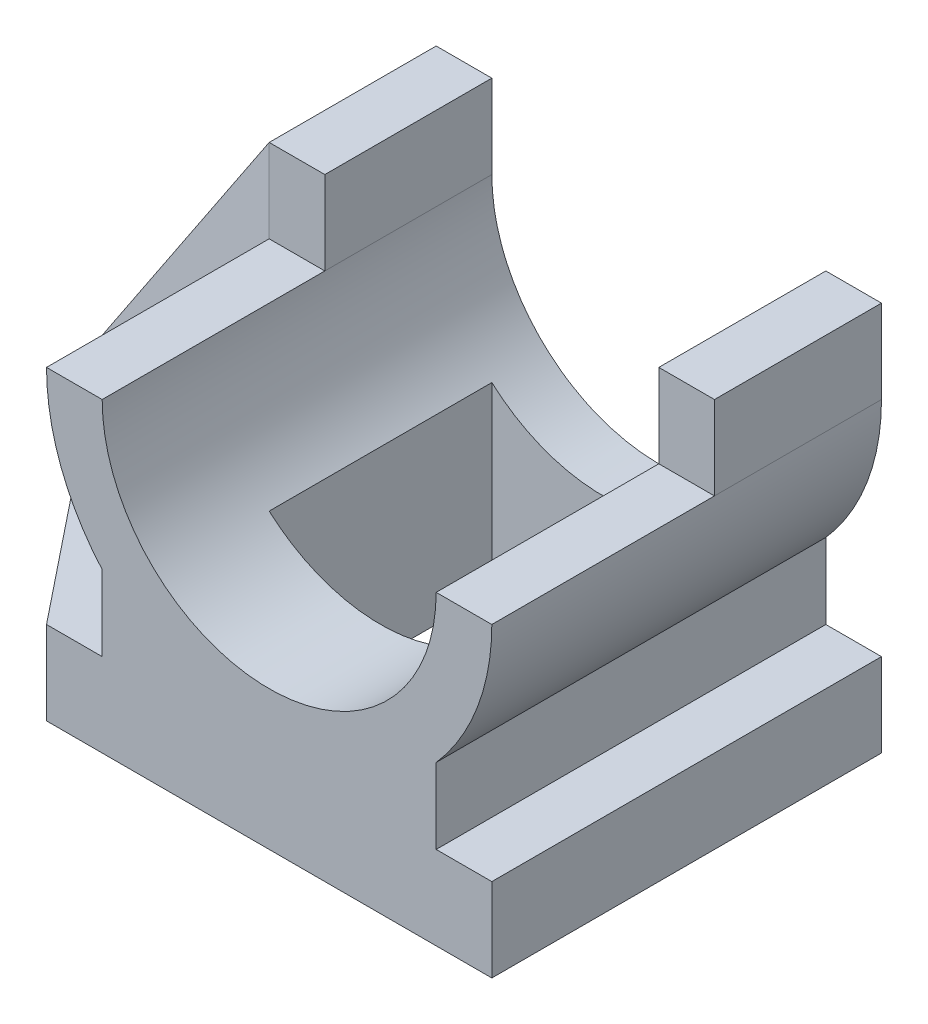
ISO-10303-21;
HEADER;
FILE_DESCRIPTION(('STEP AP214'),'2;1');
FILE_NAME('part.step','',(''),(''),'','','');
FILE_SCHEMA(('AUTOMOTIVE_DESIGN { 1 0 10303 214 1 1 1 1 }'));
ENDSEC;
DATA;
#1=APPLICATION_CONTEXT('core data for automotive mechanical design processes');
#2=APPLICATION_PROTOCOL_DEFINITION('international standard','automotive_design',2000,#1);
#3=PRODUCT_CONTEXT('',#1,'mechanical');
#4=PRODUCT('Part','Part','',(#3));
#5=PRODUCT_RELATED_PRODUCT_CATEGORY('part','',(#4));
#6=PRODUCT_DEFINITION_FORMATION('','',#4);
#7=PRODUCT_DEFINITION_CONTEXT('part definition',#1,'design');
#8=PRODUCT_DEFINITION('design','',#6,#7);
#9=PRODUCT_DEFINITION_SHAPE('','',#8);
#10=(LENGTH_UNIT() NAMED_UNIT(*) SI_UNIT(.MILLI.,.METRE.));
#11=(NAMED_UNIT(*) PLANE_ANGLE_UNIT() SI_UNIT($,.RADIAN.));
#12=(NAMED_UNIT(*) SI_UNIT($,.STERADIAN.) SOLID_ANGLE_UNIT());
#13=UNCERTAINTY_MEASURE_WITH_UNIT(LENGTH_MEASURE(1.E-05),#10,'distance_accuracy_value','');
#14=(GEOMETRIC_REPRESENTATION_CONTEXT(3) GLOBAL_UNCERTAINTY_ASSIGNED_CONTEXT((#13)) GLOBAL_UNIT_ASSIGNED_CONTEXT((#10,
#11,#12)) REPRESENTATION_CONTEXT('',''));
#15=CARTESIAN_POINT('',(0.,0.,0.));
#16=DIRECTION('',(0.,0.,1.));
#17=DIRECTION('',(1.,0.,0.));
#18=AXIS2_PLACEMENT_3D('',#15,#16,#17);
#19=CARTESIAN_POINT('',(0.,0.,30.));
#20=DIRECTION('',(0.,0.,1.));
#21=DIRECTION('',(-1.,0.,0.));
#22=AXIS2_PLACEMENT_3D('',#19,#20,#21);
#23=PLANE('',#22);
#24=DIRECTION('',(1.,0.,0.));
#25=VECTOR('',#24,1.);
#26=CARTESIAN_POINT('',(-40.,70.,30.));
#27=LINE('',#26,#25);
#28=CARTESIAN_POINT('',(-40.,70.,30.));
#29=VERTEX_POINT('',#28);
#30=CARTESIAN_POINT('',(-30.,70.,30.));
#31=VERTEX_POINT('',#30);
#32=EDGE_CURVE('E562',#29,#31,#27,.T.);
#33=ORIENTED_EDGE('',*,*,#32,.F.);
#34=DIRECTION('',(0.,-1.,0.));
#35=VECTOR('',#34,1.);
#36=CARTESIAN_POINT('',(-40.,75.,30.));
#37=LINE('',#36,#35);
#38=CARTESIAN_POINT('',(-40.,55.,30.));
#39=VERTEX_POINT('',#38);
#40=EDGE_CURVE('E204',#29,#39,#37,.T.);
#41=ORIENTED_EDGE('',*,*,#40,.T.);
#42=DIRECTION('',(-1.,0.,0.));
#43=VECTOR('',#42,1.);
#44=CARTESIAN_POINT('',(-30.,55.,30.));
#45=LINE('',#44,#43);
#46=CARTESIAN_POINT('',(-30.,55.,30.));
#47=VERTEX_POINT('',#46);
#48=EDGE_CURVE('E506',#47,#39,#45,.T.);
#49=ORIENTED_EDGE('',*,*,#48,.F.);
#50=DIRECTION('',(0.,-1.,0.));
#51=VECTOR('',#50,1.);
#52=CARTESIAN_POINT('',(-30.,70.,30.));
#53=LINE('',#52,#51);
#54=EDGE_CURVE('E270',#31,#47,#53,.T.);
#55=ORIENTED_EDGE('',*,*,#54,.F.);
#56=EDGE_LOOP('',(#33,#41,#49,#55));
#57=FACE_BOUND('',#56,.T.);
#58=ADVANCED_FACE('F39',(#57),#23,.T.);
#59=CARTESIAN_POINT('',(0.,55.,30.));
#60=DIRECTION('',(0.,0.,1.));
#61=DIRECTION('',(1.,0.,0.));
#62=AXIS2_PLACEMENT_3D('',#59,#60,#61);
#63=CIRCLE('',#62,40.);
#64=CARTESIAN_POINT('',(-30.,28.5424868893541,30.));
#65=VERTEX_POINT('',#64);
#66=EDGE_CURVE('E62',#65,#39,#63,.F.);
#67=ORIENTED_EDGE('',*,*,#66,.T.);
#68=CARTESIAN_POINT('',(-40.,15.,30.));
#69=VERTEX_POINT('',#68);
#70=EDGE_CURVE('E197',#39,#69,#37,.T.);
#71=ORIENTED_EDGE('',*,*,#70,.T.);
#72=DIRECTION('',(1.,0.,0.));
#73=VECTOR('',#72,1.);
#74=CARTESIAN_POINT('',(-30.,15.,30.));
#75=LINE('',#74,#73);
#76=CARTESIAN_POINT('',(-30.,15.,30.));
#77=VERTEX_POINT('',#76);
#78=EDGE_CURVE('E53',#69,#77,#75,.T.);
#79=ORIENTED_EDGE('',*,*,#78,.T.);
#80=DIRECTION('',(0.,1.,0.));
#81=VECTOR('',#80,1.);
#82=CARTESIAN_POINT('',(-30.,55.,30.));
#83=LINE('',#82,#81);
#84=EDGE_CURVE('E209',#77,#65,#83,.T.);
#85=ORIENTED_EDGE('',*,*,#84,.T.);
#86=EDGE_LOOP('',(#67,#71,#79,#85));
#87=FACE_BOUND('',#86,.T.);
#88=ADVANCED_FACE('F201',(#87),#23,.T.);
#89=CARTESIAN_POINT('',(-80.,15.,30.));
#90=DIRECTION('',(0.808736084303189,-0.588171697675046,0.));
#91=DIRECTION('',(0.588171697675046,0.808736084303189,0.));
#92=AXIS2_PLACEMENT_3D('',#89,#90,#91);
#93=PLANE('',#92);
#94=DIRECTION('',(-0.581914373962646,-0.800132264198639,-0.145478593490662));
#95=VECTOR('',#94,1.);
#96=CARTESIAN_POINT('',(-79.1534391534392,16.1640211640212,20.2116402116402));
#97=LINE('',#96,#95);
#98=CARTESIAN_POINT('',(-80.,15.,20.));
#99=VERTEX_POINT('',#98);
#100=EDGE_CURVE('E11',#29,#99,#97,.T.);
#101=ORIENTED_EDGE('',*,*,#100,.F.);
#102=DIRECTION('',(0.,0.,-1.));
#103=VECTOR('',#102,1.);
#104=CARTESIAN_POINT('',(-40.,70.,30.));
#105=LINE('',#104,#103);
#106=CARTESIAN_POINT('',(-40.,70.,0.));
#107=VERTEX_POINT('',#106);
#108=EDGE_CURVE('E501',#29,#107,#105,.T.);
#109=ORIENTED_EDGE('',*,*,#108,.T.);
#110=DIRECTION('',(-0.588171697675046,-0.808736084303189,0.));
#111=VECTOR('',#110,1.);
#112=CARTESIAN_POINT('',(-80.,15.,0.));
#113=LINE('',#112,#111);
#114=CARTESIAN_POINT('',(-80.,15.,0.));
#115=VERTEX_POINT('',#114);
#116=EDGE_CURVE('E211',#107,#115,#113,.T.);
#117=ORIENTED_EDGE('',*,*,#116,.T.);
#118=DIRECTION('',(0.,0.,1.));
#119=VECTOR('',#118,1.);
#120=CARTESIAN_POINT('',(-80.,15.,0.));
#121=LINE('',#120,#119);
#122=EDGE_CURVE('E218',#115,#99,#121,.T.);
#123=ORIENTED_EDGE('',*,*,#122,.T.);
#124=EDGE_LOOP('',(#101,#109,#117,#123));
#125=FACE_BOUND('',#124,.T.);
#126=ADVANCED_FACE('F303',(#125),#93,.F.);
#127=CARTESIAN_POINT('',(0.,15.,0.));
#128=DIRECTION('',(0.,-1.,0.));
#129=DIRECTION('',(0.,0.,-1.));
#130=AXIS2_PLACEMENT_3D('',#127,#128,#129);
#131=PLANE('',#130);
#132=ORIENTED_EDGE('',*,*,#78,.F.);
#133=DIRECTION('',(-0.970142500145332,0.,-0.242535625036333));
#134=VECTOR('',#133,1.);
#135=CARTESIAN_POINT('',(-80.,15.,20.));
#136=LINE('',#135,#134);
#137=EDGE_CURVE('E195',#69,#99,#136,.T.);
#138=ORIENTED_EDGE('',*,*,#137,.T.);
#139=DIRECTION('',(0.624695047554424,0.,0.78086880944303));
#140=VECTOR('',#139,1.);
#141=CARTESIAN_POINT('',(-80.,15.,20.));
#142=LINE('',#141,#140);
#143=CARTESIAN_POINT('',(-40.,15.,70.));
#144=VERTEX_POINT('',#143);
#145=EDGE_CURVE('E225',#99,#144,#142,.T.);
#146=ORIENTED_EDGE('',*,*,#145,.T.);
#147=DIRECTION('',(-1.,0.,0.));
#148=VECTOR('',#147,1.);
#149=CARTESIAN_POINT('',(-40.,15.,70.));
#150=LINE('',#149,#148);
#151=CARTESIAN_POINT('',(-30.,15.,70.));
#152=VERTEX_POINT('',#151);
#153=EDGE_CURVE('E439',#152,#144,#150,.T.);
#154=ORIENTED_EDGE('',*,*,#153,.F.);
#155=DIRECTION('',(0.,0.,-1.));
#156=VECTOR('',#155,1.);
#157=CARTESIAN_POINT('',(-30.,15.,70.));
#158=LINE('',#157,#156);
#159=EDGE_CURVE('E207',#152,#77,#158,.T.);
#160=ORIENTED_EDGE('',*,*,#159,.T.);
#161=EDGE_LOOP('',(#132,#138,#146,#154,#160));
#162=FACE_BOUND('',#161,.T.);
#163=ADVANCED_FACE('F210',(#162),#131,.F.);
#164=CARTESIAN_POINT('',(0.,0.,0.));
#165=DIRECTION('',(0.,-1.,0.));
#166=DIRECTION('',(0.,0.,-1.));
#167=AXIS2_PLACEMENT_3D('',#164,#165,#166);
#168=PLANE('',#167);
#169=DIRECTION('',(1.,0.,0.));
#170=VECTOR('',#169,1.);
#171=CARTESIAN_POINT('',(40.,0.,70.));
#172=LINE('',#171,#170);
#173=CARTESIAN_POINT('',(-40.,0.,70.));
#174=VERTEX_POINT('',#173);
#175=CARTESIAN_POINT('',(40.,0.,70.));
#176=VERTEX_POINT('',#175);
#177=EDGE_CURVE('E427',#174,#176,#172,.T.);
#178=ORIENTED_EDGE('',*,*,#177,.F.);
#179=DIRECTION('',(0.624695047554424,0.,0.78086880944303));
#180=VECTOR('',#179,1.);
#181=CARTESIAN_POINT('',(-80.,0.,20.));
#182=LINE('',#181,#180);
#183=CARTESIAN_POINT('',(-80.,0.,20.));
#184=VERTEX_POINT('',#183);
#185=EDGE_CURVE('E224',#184,#174,#182,.T.);
#186=ORIENTED_EDGE('',*,*,#185,.F.);
#187=DIRECTION('',(0.,0.,1.));
#188=VECTOR('',#187,1.);
#189=CARTESIAN_POINT('',(-80.,0.,0.));
#190=LINE('',#189,#188);
#191=CARTESIAN_POINT('',(-80.,0.,0.));
#192=VERTEX_POINT('',#191);
#193=EDGE_CURVE('E217',#192,#184,#190,.T.);
#194=ORIENTED_EDGE('',*,*,#193,.F.);
#195=DIRECTION('',(-1.,0.,0.));
#196=VECTOR('',#195,1.);
#197=CARTESIAN_POINT('',(0.,0.,0.));
#198=LINE('',#197,#196);
#199=CARTESIAN_POINT('',(40.,0.,0.));
#200=VERTEX_POINT('',#199);
#201=EDGE_CURVE('E488',#200,#192,#198,.T.);
#202=ORIENTED_EDGE('',*,*,#201,.F.);
#203=DIRECTION('',(0.,0.,-1.));
#204=VECTOR('',#203,1.);
#205=CARTESIAN_POINT('',(40.,0.,0.));
#206=LINE('',#205,#204);
#207=EDGE_CURVE('E431',#176,#200,#206,.T.);
#208=ORIENTED_EDGE('',*,*,#207,.F.);
#209=EDGE_LOOP('',(#178,#186,#194,#202,#208));
#210=FACE_BOUND('',#209,.T.);
#211=DIRECTION('',(1.,0.,0.));
#212=VECTOR('',#211,1.);
#213=CARTESIAN_POINT('',(0.,0.,10.));
#214=LINE('',#213,#212);
#215=CARTESIAN_POINT('',(20.,0.,10.));
#216=VERTEX_POINT('',#215);
#217=CARTESIAN_POINT('',(-20.,0.,10.));
#218=VERTEX_POINT('',#217);
#219=EDGE_CURVE('E244',#216,#218,#214,.F.);
#220=ORIENTED_EDGE('',*,*,#219,.T.);
#221=DIRECTION('',(0.,0.,-1.));
#222=VECTOR('',#221,1.);
#223=CARTESIAN_POINT('',(-20.,0.,0.));
#224=LINE('',#223,#222);
#225=CARTESIAN_POINT('',(-20.,0.,50.));
#226=VERTEX_POINT('',#225);
#227=EDGE_CURVE('E233',#218,#226,#224,.F.);
#228=ORIENTED_EDGE('',*,*,#227,.T.);
#229=DIRECTION('',(1.,0.,0.));
#230=VECTOR('',#229,1.);
#231=CARTESIAN_POINT('',(0.,0.,50.));
#232=LINE('',#231,#230);
#233=CARTESIAN_POINT('',(20.,0.,50.));
#234=VERTEX_POINT('',#233);
#235=EDGE_CURVE('E378',#226,#234,#232,.T.);
#236=ORIENTED_EDGE('',*,*,#235,.T.);
#237=DIRECTION('',(0.,0.,-1.));
#238=VECTOR('',#237,1.);
#239=CARTESIAN_POINT('',(20.,0.,0.));
#240=LINE('',#239,#238);
#241=EDGE_CURVE('E381',#234,#216,#240,.T.);
#242=ORIENTED_EDGE('',*,*,#241,.T.);
#243=EDGE_LOOP('',(#220,#228,#236,#242));
#244=FACE_BOUND('',#243,.T.);
#245=ADVANCED_FACE('F304',(#210,#244),#168,.T.);
#246=CARTESIAN_POINT('',(40.,55.,70.));
#247=DIRECTION('',(0.,-1.,0.));
#248=DIRECTION('',(0.,0.,-1.));
#249=AXIS2_PLACEMENT_3D('',#246,#247,#248);
#250=PLANE('',#249);
#251=DIRECTION('',(0.,0.,-1.));
#252=VECTOR('',#251,1.);
#253=CARTESIAN_POINT('',(-30.,55.,70.));
#254=LINE('',#253,#252);
#255=CARTESIAN_POINT('',(-30.,55.,70.));
#256=VERTEX_POINT('',#255);
#257=EDGE_CURVE('E250',#256,#47,#254,.T.);
#258=ORIENTED_EDGE('',*,*,#257,.T.);
#259=ORIENTED_EDGE('',*,*,#48,.T.);
#260=DIRECTION('',(0.,0.,-1.));
#261=VECTOR('',#260,1.);
#262=CARTESIAN_POINT('',(-40.,55.,70.));
#263=LINE('',#262,#261);
#264=CARTESIAN_POINT('',(-40.,55.,70.));
#265=VERTEX_POINT('',#264);
#266=EDGE_CURVE('E445',#265,#39,#263,.T.);
#267=ORIENTED_EDGE('',*,*,#266,.F.);
#268=DIRECTION('',(-1.,0.,0.));
#269=VECTOR('',#268,1.);
#270=CARTESIAN_POINT('',(40.,55.,70.));
#271=LINE('',#270,#269);
#272=EDGE_CURVE('E468',#256,#265,#271,.T.);
#273=ORIENTED_EDGE('',*,*,#272,.F.);
#274=EDGE_LOOP('',(#258,#259,#267,#273));
#275=FACE_BOUND('',#274,.T.);
#276=ADVANCED_FACE('F321',(#275),#250,.F.);
#277=DIRECTION('',(0.,0.,-1.));
#278=VECTOR('',#277,1.);
#279=CARTESIAN_POINT('',(30.,55.,70.));
#280=LINE('',#279,#278);
#281=CARTESIAN_POINT('',(30.,55.,70.));
#282=VERTEX_POINT('',#281);
#283=CARTESIAN_POINT('',(30.,55.,30.));
#284=VERTEX_POINT('',#283);
#285=EDGE_CURVE('E248',#282,#284,#280,.T.);
#286=ORIENTED_EDGE('',*,*,#285,.F.);
#287=CARTESIAN_POINT('',(40.,55.,70.));
#288=VERTEX_POINT('',#287);
#289=EDGE_CURVE('E470',#288,#282,#271,.T.);
#290=ORIENTED_EDGE('',*,*,#289,.F.);
#291=DIRECTION('',(0.,0.,-1.));
#292=VECTOR('',#291,1.);
#293=CARTESIAN_POINT('',(40.,55.,70.));
#294=LINE('',#293,#292);
#295=CARTESIAN_POINT('',(40.,55.,30.));
#296=VERTEX_POINT('',#295);
#297=EDGE_CURVE('E471',#288,#296,#294,.T.);
#298=ORIENTED_EDGE('',*,*,#297,.T.);
#299=DIRECTION('',(1.,0.,0.));
#300=VECTOR('',#299,1.);
#301=CARTESIAN_POINT('',(30.,55.,30.));
#302=LINE('',#301,#300);
#303=EDGE_CURVE('E448',#284,#296,#302,.T.);
#304=ORIENTED_EDGE('',*,*,#303,.F.);
#305=EDGE_LOOP('',(#286,#290,#298,#304));
#306=FACE_BOUND('',#305,.T.);
#307=ADVANCED_FACE('F322',(#306),#250,.F.);
#308=CARTESIAN_POINT('',(0.,15.,0.));
#309=DIRECTION('',(0.,0.,1.));
#310=DIRECTION('',(1.,0.,0.));
#311=AXIS2_PLACEMENT_3D('',#308,#309,#310);
#312=PLANE('',#311);
#313=ORIENTED_EDGE('',*,*,#116,.F.);
#314=DIRECTION('',(1.,0.,0.));
#315=VECTOR('',#314,1.);
#316=CARTESIAN_POINT('',(-40.,70.,0.));
#317=LINE('',#316,#315);
#318=CARTESIAN_POINT('',(-30.,70.,0.));
#319=VERTEX_POINT('',#318);
#320=EDGE_CURVE('E358',#107,#319,#317,.T.);
#321=ORIENTED_EDGE('',*,*,#320,.T.);
#322=DIRECTION('',(0.,1.,0.));
#323=VECTOR('',#322,1.);
#324=CARTESIAN_POINT('',(-30.,15.,0.));
#325=LINE('',#324,#323);
#326=CARTESIAN_POINT('',(-30.,55.,-6.E-06));
#327=VERTEX_POINT('',#326);
#328=EDGE_CURVE('E351',#319,#327,#325,.F.);
#329=ORIENTED_EDGE('',*,*,#328,.T.);
#330=CARTESIAN_POINT('',(-30.,55.,0.));
#331=CARTESIAN_POINT('',(-30.,52.0455229689366,0.));
#332=CARTESIAN_POINT('',(-29.4235584120969,49.1472903395161,0.));
#333=CARTESIAN_POINT('',(-28.8472699521832,46.2498276068982,0.));
#334=CARTESIAN_POINT('',(-27.7163859753386,43.5194970290473,0.));
#335=CARTESIAN_POINT('',(-26.585903799089,40.7901365316584,0.));
#336=CARTESIAN_POINT('',(-24.9440883690764,38.3328930094119,0.));
#337=CARTESIAN_POINT('',(-23.3028562725141,35.876522540443,0.));
#338=CARTESIAN_POINT('',(-21.2132034355964,33.7867965644036,0.));
#339=CARTESIAN_POINT('',(-19.1242930477724,31.697813063444,0.));
#340=CARTESIAN_POINT('',(-16.6671069905881,30.0559116309236,0.));
#341=CARTESIAN_POINT('',(-14.2107939662426,28.4145935623959,0.));
#342=CARTESIAN_POINT('',(-11.4805029709527,27.2836140246614,0.));
#343=CARTESIAN_POINT('',(-8.75118204209679,26.1530363214892,0.));
#344=CARTESIAN_POINT('',(-5.85270966048385,25.5764415879031,0.));
#345=CARTESIAN_POINT('',(-2.95526709985799,25.0000517171824,0.));
#346=CARTESIAN_POINT('',(0.,25.,0.));
#347=CARTESIAN_POINT('',(2.95421709982425,24.9999483011926,0.));
#348=CARTESIAN_POINT('',(5.85270966048386,25.5764415879031,0.));
#349=CARTESIAN_POINT('',(8.75017239308338,26.1527300478112,0.));
#350=CARTESIAN_POINT('',(11.4805029709527,27.2836140246614,0.));
#351=CARTESIAN_POINT('',(14.2098634683337,28.4140962009057,0.));
#352=CARTESIAN_POINT('',(16.6671069905881,30.0559116309236,0.));
#353=CARTESIAN_POINT('',(19.1234774594981,31.6971437274466,0.));
#354=CARTESIAN_POINT('',(21.2132034355964,33.7867965644036,0.));
#355=CARTESIAN_POINT('',(23.3021869365168,35.8757069521689,0.));
#356=CARTESIAN_POINT('',(24.9440883690764,38.3328930094119,0.));
#357=CARTESIAN_POINT('',(26.5854064375838,40.7892060337271,0.));
#358=CARTESIAN_POINT('',(27.7163859753386,43.5194970290473,0.));
#359=CARTESIAN_POINT('',(28.846963678496,46.248817957849,0.));
#360=CARTESIAN_POINT('',(29.4235584120969,49.1472903395162,0.));
#361=CARTESIAN_POINT('',(30.,52.0449928761786,0.));
#362=CARTESIAN_POINT('',(30.,55.,0.));
#363=B_SPLINE_CURVE_WITH_KNOTS('',2,(#330,#331,#332,#333,#334,#335,#336,#337,#338,#339,#340,
#341,#342,#343,#344,#345,#346,#347,#348,#349,#350,#351,#352,#353,#354,#355,#356,#357,#358,#359,
#360,#361,#362),.UNSPECIFIED.,.F.,.F.,(3,2,2,2,2,2,2,2,2,2,2,2,2,2,2,2,3),(0.,0.0625,0.125,
0.1875,0.25,0.3125,0.375,0.4375,0.5,0.5625,0.625,0.6875,0.75,0.8125,0.875,0.9375,1.),.UNSPECIFIED.);
#364=CARTESIAN_POINT('',(30.,55.,-6.E-06));
#365=VERTEX_POINT('',#364);
#366=EDGE_CURVE('E251',#327,#365,#363,.T.);
#367=ORIENTED_EDGE('',*,*,#366,.T.);
#368=DIRECTION('',(0.,1.,0.));
#369=VECTOR('',#368,1.);
#370=CARTESIAN_POINT('',(30.,70.,0.));
#371=LINE('',#370,#369);
#372=CARTESIAN_POINT('',(30.,70.,0.));
#373=VERTEX_POINT('',#372);
#374=EDGE_CURVE('E362',#373,#365,#371,.F.);
#375=ORIENTED_EDGE('',*,*,#374,.F.);
#376=DIRECTION('',(-1.,0.,0.));
#377=VECTOR('',#376,1.);
#378=CARTESIAN_POINT('',(40.,70.,0.));
#379=LINE('',#378,#377);
#380=CARTESIAN_POINT('',(40.,70.,0.));
#381=VERTEX_POINT('',#380);
#382=EDGE_CURVE('E450',#381,#373,#379,.T.);
#383=ORIENTED_EDGE('',*,*,#382,.F.);
#384=DIRECTION('',(0.,1.,0.));
#385=VECTOR('',#384,1.);
#386=CARTESIAN_POINT('',(40.,55.,0.));
#387=LINE('',#386,#385);
#388=CARTESIAN_POINT('',(40.,55.,0.));
#389=VERTEX_POINT('',#388);
#390=EDGE_CURVE('E364',#389,#381,#387,.T.);
#391=ORIENTED_EDGE('',*,*,#390,.F.);
#392=CARTESIAN_POINT('',(0.,55.,0.));
#393=DIRECTION('',(0.,0.,1.));
#394=DIRECTION('',(1.,0.,0.));
#395=AXIS2_PLACEMENT_3D('',#392,#393,#394);
#396=CIRCLE('',#395,40.);
#397=CARTESIAN_POINT('',(30.,28.5424868893541,0.));
#398=VERTEX_POINT('',#397);
#399=EDGE_CURVE('E467',#398,#389,#396,.T.);
#400=ORIENTED_EDGE('',*,*,#399,.F.);
#401=DIRECTION('',(0.,1.,0.));
#402=VECTOR('',#401,1.);
#403=CARTESIAN_POINT('',(30.,15.,0.));
#404=LINE('',#403,#402);
#405=CARTESIAN_POINT('',(30.,15.,0.));
#406=VERTEX_POINT('',#405);
#407=EDGE_CURVE('E475',#406,#398,#404,.T.);
#408=ORIENTED_EDGE('',*,*,#407,.F.);
#409=DIRECTION('',(-1.,0.,0.));
#410=VECTOR('',#409,1.);
#411=CARTESIAN_POINT('',(0.,15.,0.));
#412=LINE('',#411,#410);
#413=CARTESIAN_POINT('',(40.,15.,0.));
#414=VERTEX_POINT('',#413);
#415=EDGE_CURVE('E489',#414,#406,#412,.T.);
#416=ORIENTED_EDGE('',*,*,#415,.F.);
#417=DIRECTION('',(0.,-1.,0.));
#418=VECTOR('',#417,1.);
#419=CARTESIAN_POINT('',(40.,15.,0.));
#420=LINE('',#419,#418);
#421=EDGE_CURVE('E491',#414,#200,#420,.T.);
#422=ORIENTED_EDGE('',*,*,#421,.T.);
#423=ORIENTED_EDGE('',*,*,#201,.T.);
#424=DIRECTION('',(0.,-1.,0.));
#425=VECTOR('',#424,1.);
#426=CARTESIAN_POINT('',(-80.,15.,0.));
#427=LINE('',#426,#425);
#428=EDGE_CURVE('E231',#115,#192,#427,.T.);
#429=ORIENTED_EDGE('',*,*,#428,.F.);
#430=EDGE_LOOP('',(#313,#321,#329,#367,#375,#383,#391,#400,#408,#416,#422,#423,#429));
#431=FACE_BOUND('',#430,.T.);
#432=ADVANCED_FACE('F337',(#431),#312,.F.);
#433=CARTESIAN_POINT('',(0.,15.,0.));
#434=DIRECTION('',(0.,-1.,0.));
#435=DIRECTION('',(0.,0.,-1.));
#436=AXIS2_PLACEMENT_3D('',#433,#434,#435);
#437=PLANE('',#436);
#438=DIRECTION('',(0.,0.,-1.));
#439=VECTOR('',#438,1.);
#440=CARTESIAN_POINT('',(30.,15.,70.));
#441=LINE('',#440,#439);
#442=CARTESIAN_POINT('',(30.,15.,70.));
#443=VERTEX_POINT('',#442);
#444=EDGE_CURVE('E434',#443,#406,#441,.T.);
#445=ORIENTED_EDGE('',*,*,#444,.F.);
#446=DIRECTION('',(1.,0.,0.));
#447=VECTOR('',#446,1.);
#448=CARTESIAN_POINT('',(40.,15.,70.));
#449=LINE('',#448,#447);
#450=CARTESIAN_POINT('',(40.,15.,70.));
#451=VERTEX_POINT('',#450);
#452=EDGE_CURVE('E484',#443,#451,#449,.T.);
#453=ORIENTED_EDGE('',*,*,#452,.T.);
#454=DIRECTION('',(0.,0.,-1.));
#455=VECTOR('',#454,1.);
#456=CARTESIAN_POINT('',(40.,15.,0.));
#457=LINE('',#456,#455);
#458=EDGE_CURVE('E490',#451,#414,#457,.T.);
#459=ORIENTED_EDGE('',*,*,#458,.T.);
#460=ORIENTED_EDGE('',*,*,#415,.T.);
#461=EDGE_LOOP('',(#445,#453,#459,#460));
#462=FACE_BOUND('',#461,.T.);
#463=ADVANCED_FACE('F331',(#462),#437,.F.);
#464=CARTESIAN_POINT('',(40.,15.,70.));
#465=DIRECTION('',(0.,0.,-1.));
#466=DIRECTION('',(-1.,0.,0.));
#467=AXIS2_PLACEMENT_3D('',#464,#465,#466);
#468=PLANE('',#467);
#469=CARTESIAN_POINT('',(0.,55.,70.));
#470=DIRECTION('',(0.,0.,1.));
#471=DIRECTION('',(1.,0.,0.));
#472=AXIS2_PLACEMENT_3D('',#469,#470,#471);
#473=CIRCLE('',#472,30.);
#474=EDGE_CURVE('E236',#256,#282,#473,.T.);
#475=ORIENTED_EDGE('',*,*,#474,.F.);
#476=ORIENTED_EDGE('',*,*,#272,.T.);
#477=CARTESIAN_POINT('',(0.,55.,70.));
#478=DIRECTION('',(0.,0.,-1.));
#479=DIRECTION('',(-1.,0.,0.));
#480=AXIS2_PLACEMENT_3D('',#477,#478,#479);
#481=CIRCLE('',#480,40.);
#482=CARTESIAN_POINT('',(-30.,28.5424868893541,70.));
#483=VERTEX_POINT('',#482);
#484=EDGE_CURVE('E498',#483,#265,#481,.T.);
#485=ORIENTED_EDGE('',*,*,#484,.F.);
#486=DIRECTION('',(0.,1.,0.));
#487=VECTOR('',#486,1.);
#488=CARTESIAN_POINT('',(-30.,15.,70.));
#489=LINE('',#488,#487);
#490=EDGE_CURVE('E559',#152,#483,#489,.T.);
#491=ORIENTED_EDGE('',*,*,#490,.F.);
#492=ORIENTED_EDGE('',*,*,#153,.T.);
#493=DIRECTION('',(0.,-1.,0.));
#494=VECTOR('',#493,1.);
#495=CARTESIAN_POINT('',(-40.,15.,70.));
#496=LINE('',#495,#494);
#497=EDGE_CURVE('E368',#144,#174,#496,.T.);
#498=ORIENTED_EDGE('',*,*,#497,.T.);
#499=ORIENTED_EDGE('',*,*,#177,.T.);
#500=DIRECTION('',(0.,-1.,0.));
#501=VECTOR('',#500,1.);
#502=CARTESIAN_POINT('',(40.,15.,70.));
#503=LINE('',#502,#501);
#504=EDGE_CURVE('E375',#451,#176,#503,.T.);
#505=ORIENTED_EDGE('',*,*,#504,.F.);
#506=ORIENTED_EDGE('',*,*,#452,.F.);
#507=DIRECTION('',(0.,1.,0.));
#508=VECTOR('',#507,1.);
#509=CARTESIAN_POINT('',(30.,15.,70.));
#510=LINE('',#509,#508);
#511=CARTESIAN_POINT('',(30.,28.5424868893541,70.));
#512=VERTEX_POINT('',#511);
#513=EDGE_CURVE('E463',#443,#512,#510,.T.);
#514=ORIENTED_EDGE('',*,*,#513,.T.);
#515=CARTESIAN_POINT('',(0.,55.,70.));
#516=DIRECTION('',(0.,0.,1.));
#517=DIRECTION('',(1.,0.,0.));
#518=AXIS2_PLACEMENT_3D('',#515,#516,#517);
#519=CIRCLE('',#518,40.);
#520=EDGE_CURVE('E466',#512,#288,#519,.T.);
#521=ORIENTED_EDGE('',*,*,#520,.T.);
#522=ORIENTED_EDGE('',*,*,#289,.T.);
#523=EDGE_LOOP('',(#475,#476,#485,#491,#492,#498,#499,#505,#506,#514,#521,#522));
#524=FACE_BOUND('',#523,.T.);
#525=ADVANCED_FACE('F41',(#524),#468,.F.);
#526=CARTESIAN_POINT('',(40.,15.,0.));
#527=DIRECTION('',(-1.,0.,0.));
#528=DIRECTION('',(0.,0.,1.));
#529=AXIS2_PLACEMENT_3D('',#526,#527,#528);
#530=PLANE('',#529);
#531=ORIENTED_EDGE('',*,*,#207,.T.);
#532=ORIENTED_EDGE('',*,*,#421,.F.);
#533=ORIENTED_EDGE('',*,*,#458,.F.);
#534=ORIENTED_EDGE('',*,*,#504,.T.);
#535=EDGE_LOOP('',(#531,#532,#533,#534));
#536=FACE_BOUND('',#535,.T.);
#537=ADVANCED_FACE('F335',(#536),#530,.F.);
#538=CARTESIAN_POINT('',(30.,15.,70.));
#539=DIRECTION('',(-1.,0.,0.));
#540=DIRECTION('',(0.,0.,1.));
#541=AXIS2_PLACEMENT_3D('',#538,#539,#540);
#542=PLANE('',#541);
#543=ORIENTED_EDGE('',*,*,#407,.T.);
#544=DIRECTION('',(0.,0.,-1.));
#545=VECTOR('',#544,1.);
#546=CARTESIAN_POINT('',(30.,28.5424868893541,70.));
#547=LINE('',#546,#545);
#548=EDGE_CURVE('E477',#512,#398,#547,.T.);
#549=ORIENTED_EDGE('',*,*,#548,.F.);
#550=ORIENTED_EDGE('',*,*,#513,.F.);
#551=ORIENTED_EDGE('',*,*,#444,.T.);
#552=EDGE_LOOP('',(#543,#549,#550,#551));
#553=FACE_BOUND('',#552,.T.);
#554=ADVANCED_FACE('F327',(#553),#542,.F.);
#555=CARTESIAN_POINT('',(0.,55.,70.));
#556=DIRECTION('',(0.,0.,-1.));
#557=DIRECTION('',(-1.,0.,0.));
#558=AXIS2_PLACEMENT_3D('',#555,#556,#557);
#559=CYLINDRICAL_SURFACE('',#558,40.);
#560=ORIENTED_EDGE('',*,*,#399,.T.);
#561=DIRECTION('',(0.,0.,-1.));
#562=VECTOR('',#561,1.);
#563=CARTESIAN_POINT('',(40.,55.,30.));
#564=LINE('',#563,#562);
#565=EDGE_CURVE('E461',#296,#389,#564,.T.);
#566=ORIENTED_EDGE('',*,*,#565,.F.);
#567=ORIENTED_EDGE('',*,*,#297,.F.);
#568=ORIENTED_EDGE('',*,*,#520,.F.);
#569=ORIENTED_EDGE('',*,*,#548,.T.);
#570=EDGE_LOOP('',(#560,#566,#567,#568,#569));
#571=FACE_BOUND('',#570,.T.);
#572=ADVANCED_FACE('F317',(#571),#559,.T.);
#573=CARTESIAN_POINT('',(30.,70.,30.));
#574=DIRECTION('',(1.,0.,0.));
#575=DIRECTION('',(0.,0.,-1.));
#576=AXIS2_PLACEMENT_3D('',#573,#574,#575);
#577=PLANE('',#576);
#578=ORIENTED_EDGE('',*,*,#374,.T.);
#579=DIRECTION('',(0.,0.,-1.));
#580=VECTOR('',#579,1.);
#581=CARTESIAN_POINT('',(30.,55.,30.));
#582=LINE('',#581,#580);
#583=EDGE_CURVE('E464',#284,#365,#582,.T.);
#584=ORIENTED_EDGE('',*,*,#583,.F.);
#585=DIRECTION('',(0.,-1.,0.));
#586=VECTOR('',#585,1.);
#587=CARTESIAN_POINT('',(30.,70.,30.));
#588=LINE('',#587,#586);
#589=CARTESIAN_POINT('',(30.,70.,30.));
#590=VERTEX_POINT('',#589);
#591=EDGE_CURVE('E446',#590,#284,#588,.T.);
#592=ORIENTED_EDGE('',*,*,#591,.F.);
#593=DIRECTION('',(0.,0.,-1.));
#594=VECTOR('',#593,1.);
#595=CARTESIAN_POINT('',(30.,70.,30.));
#596=LINE('',#595,#594);
#597=EDGE_CURVE('E457',#590,#373,#596,.T.);
#598=ORIENTED_EDGE('',*,*,#597,.T.);
#599=EDGE_LOOP('',(#578,#584,#592,#598));
#600=FACE_BOUND('',#599,.T.);
#601=ADVANCED_FACE('F312',(#600),#577,.F.);
#602=CARTESIAN_POINT('',(40.,55.,30.));
#603=DIRECTION('',(-1.,0.,0.));
#604=DIRECTION('',(0.,0.,1.));
#605=AXIS2_PLACEMENT_3D('',#602,#603,#604);
#606=PLANE('',#605);
#607=ORIENTED_EDGE('',*,*,#390,.T.);
#608=DIRECTION('',(0.,0.,-1.));
#609=VECTOR('',#608,1.);
#610=CARTESIAN_POINT('',(40.,70.,30.));
#611=LINE('',#610,#609);
#612=CARTESIAN_POINT('',(40.,70.,30.));
#613=VERTEX_POINT('',#612);
#614=EDGE_CURVE('E456',#613,#381,#611,.T.);
#615=ORIENTED_EDGE('',*,*,#614,.F.);
#616=DIRECTION('',(0.,1.,0.));
#617=VECTOR('',#616,1.);
#618=CARTESIAN_POINT('',(40.,55.,30.));
#619=LINE('',#618,#617);
#620=EDGE_CURVE('E452',#296,#613,#619,.T.);
#621=ORIENTED_EDGE('',*,*,#620,.F.);
#622=ORIENTED_EDGE('',*,*,#565,.T.);
#623=EDGE_LOOP('',(#607,#615,#621,#622));
#624=FACE_BOUND('',#623,.T.);
#625=ADVANCED_FACE('F313',(#624),#606,.F.);
#626=CARTESIAN_POINT('',(40.,70.,30.));
#627=DIRECTION('',(0.,-1.,0.));
#628=DIRECTION('',(0.,0.,-1.));
#629=AXIS2_PLACEMENT_3D('',#626,#627,#628);
#630=PLANE('',#629);
#631=ORIENTED_EDGE('',*,*,#382,.T.);
#632=ORIENTED_EDGE('',*,*,#597,.F.);
#633=DIRECTION('',(-1.,0.,0.));
#634=VECTOR('',#633,1.);
#635=CARTESIAN_POINT('',(40.,70.,30.));
#636=LINE('',#635,#634);
#637=EDGE_CURVE('E453',#613,#590,#636,.T.);
#638=ORIENTED_EDGE('',*,*,#637,.F.);
#639=ORIENTED_EDGE('',*,*,#614,.T.);
#640=EDGE_LOOP('',(#631,#632,#638,#639));
#641=FACE_BOUND('',#640,.T.);
#642=ADVANCED_FACE('F307',(#641),#630,.F.);
#643=CARTESIAN_POINT('',(0.,0.,30.));
#644=DIRECTION('',(0.,0.,1.));
#645=DIRECTION('',(1.,0.,0.));
#646=AXIS2_PLACEMENT_3D('',#643,#644,#645);
#647=PLANE('',#646);
#648=ORIENTED_EDGE('',*,*,#591,.T.);
#649=ORIENTED_EDGE('',*,*,#303,.T.);
#650=ORIENTED_EDGE('',*,*,#620,.T.);
#651=ORIENTED_EDGE('',*,*,#637,.T.);
#652=EDGE_LOOP('',(#648,#649,#650,#651));
#653=FACE_BOUND('',#652,.T.);
#654=ADVANCED_FACE('F300',(#653),#647,.T.);
#655=CARTESIAN_POINT('',(0.,55.,70.));
#656=DIRECTION('',(0.,0.,-1.));
#657=DIRECTION('',(-1.,0.,0.));
#658=AXIS2_PLACEMENT_3D('',#655,#656,#657);
#659=CYLINDRICAL_SURFACE('',#658,40.);
#660=ORIENTED_EDGE('',*,*,#66,.F.);
#661=DIRECTION('',(0.,0.,-1.));
#662=VECTOR('',#661,1.);
#663=CARTESIAN_POINT('',(-30.,28.5424868893541,70.));
#664=LINE('',#663,#662);
#665=EDGE_CURVE('E561',#483,#65,#664,.T.);
#666=ORIENTED_EDGE('',*,*,#665,.F.);
#667=ORIENTED_EDGE('',*,*,#484,.T.);
#668=ORIENTED_EDGE('',*,*,#266,.T.);
#669=EDGE_LOOP('',(#660,#666,#667,#668));
#670=FACE_BOUND('',#669,.T.);
#671=ADVANCED_FACE('F296',(#670),#659,.T.);
#672=CARTESIAN_POINT('',(-30.,15.,70.));
#673=DIRECTION('',(-1.,0.,0.));
#674=DIRECTION('',(0.,0.,1.));
#675=AXIS2_PLACEMENT_3D('',#672,#673,#674);
#676=PLANE('',#675);
#677=ORIENTED_EDGE('',*,*,#84,.F.);
#678=ORIENTED_EDGE('',*,*,#159,.F.);
#679=ORIENTED_EDGE('',*,*,#490,.T.);
#680=ORIENTED_EDGE('',*,*,#665,.T.);
#681=EDGE_LOOP('',(#677,#678,#679,#680));
#682=FACE_BOUND('',#681,.T.);
#683=ADVANCED_FACE('F295',(#682),#676,.T.);
#684=CARTESIAN_POINT('',(-30.,70.,30.));
#685=DIRECTION('',(1.,0.,0.));
#686=DIRECTION('',(0.,0.,-1.));
#687=AXIS2_PLACEMENT_3D('',#684,#685,#686);
#688=PLANE('',#687);
#689=ORIENTED_EDGE('',*,*,#328,.F.);
#690=DIRECTION('',(0.,0.,-1.));
#691=VECTOR('',#690,1.);
#692=CARTESIAN_POINT('',(-30.,70.,30.));
#693=LINE('',#692,#691);
#694=EDGE_CURVE('E499',#31,#319,#693,.T.);
#695=ORIENTED_EDGE('',*,*,#694,.F.);
#696=ORIENTED_EDGE('',*,*,#54,.T.);
#697=DIRECTION('',(0.,0.,-1.));
#698=VECTOR('',#697,1.);
#699=CARTESIAN_POINT('',(-30.,55.,30.));
#700=LINE('',#699,#698);
#701=EDGE_CURVE('E503',#47,#327,#700,.T.);
#702=ORIENTED_EDGE('',*,*,#701,.T.);
#703=EDGE_LOOP('',(#689,#695,#696,#702));
#704=FACE_BOUND('',#703,.T.);
#705=ADVANCED_FACE('F289',(#704),#688,.T.);
#706=CARTESIAN_POINT('',(-40.,70.,30.));
#707=DIRECTION('',(0.,1.,0.));
#708=DIRECTION('',(0.,0.,1.));
#709=AXIS2_PLACEMENT_3D('',#706,#707,#708);
#710=PLANE('',#709);
#711=ORIENTED_EDGE('',*,*,#320,.F.);
#712=ORIENTED_EDGE('',*,*,#108,.F.);
#713=ORIENTED_EDGE('',*,*,#32,.T.);
#714=ORIENTED_EDGE('',*,*,#694,.T.);
#715=EDGE_LOOP('',(#711,#712,#713,#714));
#716=FACE_BOUND('',#715,.T.);
#717=ADVANCED_FACE('F278',(#716),#710,.T.);
#718=CARTESIAN_POINT('',(0.,55.,70.));
#719=DIRECTION('',(0.,0.,-1.));
#720=DIRECTION('',(-1.,0.,0.));
#721=AXIS2_PLACEMENT_3D('',#718,#719,#720);
#722=CYLINDRICAL_SURFACE('',#721,30.);
#723=DIRECTION('',(0.,0.,-1.));
#724=VECTOR('',#723,1.);
#725=CARTESIAN_POINT('',(-20.,32.6393202250021,70.));
#726=LINE('',#725,#724);
#727=CARTESIAN_POINT('',(-20.,32.6393202250021,10.));
#728=VERTEX_POINT('',#727);
#729=CARTESIAN_POINT('',(-20.,32.6393202250021,50.));
#730=VERTEX_POINT('',#729);
#731=EDGE_CURVE('E50',#728,#730,#726,.F.);
#732=ORIENTED_EDGE('',*,*,#731,.F.);
#733=CARTESIAN_POINT('',(0.,55.,10.));
#734=DIRECTION('',(0.,0.,-1.));
#735=DIRECTION('',(-1.,0.,0.));
#736=AXIS2_PLACEMENT_3D('',#733,#734,#735);
#737=CIRCLE('',#736,30.);
#738=CARTESIAN_POINT('',(20.,32.6393202250021,10.));
#739=VERTEX_POINT('',#738);
#740=EDGE_CURVE('E372',#739,#728,#737,.T.);
#741=ORIENTED_EDGE('',*,*,#740,.F.);
#742=DIRECTION('',(0.,0.,-1.));
#743=VECTOR('',#742,1.);
#744=CARTESIAN_POINT('',(20.,32.6393202250021,70.));
#745=LINE('',#744,#743);
#746=CARTESIAN_POINT('',(20.,32.6393202250021,50.));
#747=VERTEX_POINT('',#746);
#748=EDGE_CURVE('E371',#747,#739,#745,.T.);
#749=ORIENTED_EDGE('',*,*,#748,.F.);
#750=CARTESIAN_POINT('',(0.,55.,50.));
#751=DIRECTION('',(0.,0.,1.));
#752=DIRECTION('',(1.,0.,0.));
#753=AXIS2_PLACEMENT_3D('',#750,#751,#752);
#754=CIRCLE('',#753,30.);
#755=EDGE_CURVE('E369',#730,#747,#754,.T.);
#756=ORIENTED_EDGE('',*,*,#755,.F.);
#757=EDGE_LOOP('',(#732,#741,#749,#756));
#758=FACE_BOUND('',#757,.T.);
#759=ORIENTED_EDGE('',*,*,#366,.F.);
#760=ORIENTED_EDGE('',*,*,#701,.F.);
#761=ORIENTED_EDGE('',*,*,#257,.F.);
#762=ORIENTED_EDGE('',*,*,#474,.T.);
#763=ORIENTED_EDGE('',*,*,#285,.T.);
#764=ORIENTED_EDGE('',*,*,#583,.T.);
#765=EDGE_LOOP('',(#759,#760,#761,#762,#763,#764));
#766=FACE_BOUND('',#765,.T.);
#767=ADVANCED_FACE('F267',(#758,#766),#722,.F.);
#768=CARTESIAN_POINT('',(-20.,-1.2E-05,50.));
#769=DIRECTION('',(-1.,0.,0.));
#770=DIRECTION('',(0.,0.,1.));
#771=AXIS2_PLACEMENT_3D('',#768,#769,#770);
#772=PLANE('',#771);
#773=ORIENTED_EDGE('',*,*,#731,.T.);
#774=DIRECTION('',(0.,1.,0.));
#775=VECTOR('',#774,1.);
#776=CARTESIAN_POINT('',(-20.,-1.2E-05,50.));
#777=LINE('',#776,#775);
#778=EDGE_CURVE('E238',#226,#730,#777,.T.);
#779=ORIENTED_EDGE('',*,*,#778,.F.);
#780=ORIENTED_EDGE('',*,*,#227,.F.);
#781=DIRECTION('',(0.,1.,0.));
#782=VECTOR('',#781,1.);
#783=CARTESIAN_POINT('',(-20.,-1.2E-05,10.));
#784=LINE('',#783,#782);
#785=EDGE_CURVE('E235',#218,#728,#784,.T.);
#786=ORIENTED_EDGE('',*,*,#785,.T.);
#787=EDGE_LOOP('',(#773,#779,#780,#786));
#788=FACE_BOUND('',#787,.T.);
#789=ADVANCED_FACE('F276',(#788),#772,.F.);
#790=CARTESIAN_POINT('',(-20.,-1.2E-05,10.));
#791=DIRECTION('',(0.,0.,-1.));
#792=DIRECTION('',(-1.,0.,0.));
#793=AXIS2_PLACEMENT_3D('',#790,#791,#792);
#794=PLANE('',#793);
#795=ORIENTED_EDGE('',*,*,#740,.T.);
#796=ORIENTED_EDGE('',*,*,#785,.F.);
#797=ORIENTED_EDGE('',*,*,#219,.F.);
#798=DIRECTION('',(0.,1.,0.));
#799=VECTOR('',#798,1.);
#800=CARTESIAN_POINT('',(20.,-1.2E-05,10.));
#801=LINE('',#800,#799);
#802=EDGE_CURVE('E239',#216,#739,#801,.T.);
#803=ORIENTED_EDGE('',*,*,#802,.T.);
#804=EDGE_LOOP('',(#795,#796,#797,#803));
#805=FACE_BOUND('',#804,.T.);
#806=ADVANCED_FACE('F402',(#805),#794,.F.);
#807=CARTESIAN_POINT('',(20.,-1.2E-05,10.));
#808=DIRECTION('',(1.,0.,0.));
#809=DIRECTION('',(0.,0.,-1.));
#810=AXIS2_PLACEMENT_3D('',#807,#808,#809);
#811=PLANE('',#810);
#812=ORIENTED_EDGE('',*,*,#748,.T.);
#813=ORIENTED_EDGE('',*,*,#802,.F.);
#814=ORIENTED_EDGE('',*,*,#241,.F.);
#815=DIRECTION('',(0.,1.,0.));
#816=VECTOR('',#815,1.);
#817=CARTESIAN_POINT('',(20.,-1.2E-05,50.));
#818=LINE('',#817,#816);
#819=EDGE_CURVE('E242',#234,#747,#818,.T.);
#820=ORIENTED_EDGE('',*,*,#819,.T.);
#821=EDGE_LOOP('',(#812,#813,#814,#820));
#822=FACE_BOUND('',#821,.T.);
#823=ADVANCED_FACE('F399',(#822),#811,.F.);
#824=CARTESIAN_POINT('',(20.,-1.2E-05,50.));
#825=DIRECTION('',(0.,0.,1.));
#826=DIRECTION('',(1.,0.,0.));
#827=AXIS2_PLACEMENT_3D('',#824,#825,#826);
#828=PLANE('',#827);
#829=ORIENTED_EDGE('',*,*,#755,.T.);
#830=ORIENTED_EDGE('',*,*,#819,.F.);
#831=ORIENTED_EDGE('',*,*,#235,.F.);
#832=ORIENTED_EDGE('',*,*,#778,.T.);
#833=EDGE_LOOP('',(#829,#830,#831,#832));
#834=FACE_BOUND('',#833,.T.);
#835=ADVANCED_FACE('F395',(#834),#828,.F.);
#836=CARTESIAN_POINT('',(-80.,15.,0.));
#837=DIRECTION('',(1.,0.,0.));
#838=DIRECTION('',(0.,0.,-1.));
#839=AXIS2_PLACEMENT_3D('',#836,#837,#838);
#840=PLANE('',#839);
#841=ORIENTED_EDGE('',*,*,#193,.T.);
#842=DIRECTION('',(0.,-1.,0.));
#843=VECTOR('',#842,1.);
#844=CARTESIAN_POINT('',(-80.,15.,20.));
#845=LINE('',#844,#843);
#846=EDGE_CURVE('E223',#99,#184,#845,.T.);
#847=ORIENTED_EDGE('',*,*,#846,.F.);
#848=ORIENTED_EDGE('',*,*,#122,.F.);
#849=ORIENTED_EDGE('',*,*,#428,.T.);
#850=EDGE_LOOP('',(#841,#847,#848,#849));
#851=FACE_BOUND('',#850,.T.);
#852=ADVANCED_FACE('F410',(#851),#840,.F.);
#853=CARTESIAN_POINT('',(-80.,15.,20.));
#854=DIRECTION('',(0.78086880944303,0.,-0.624695047554424));
#855=DIRECTION('',(-0.624695047554424,0.,-0.78086880944303));
#856=AXIS2_PLACEMENT_3D('',#853,#854,#855);
#857=PLANE('',#856);
#858=ORIENTED_EDGE('',*,*,#185,.T.);
#859=ORIENTED_EDGE('',*,*,#497,.F.);
#860=ORIENTED_EDGE('',*,*,#145,.F.);
#861=ORIENTED_EDGE('',*,*,#846,.T.);
#862=EDGE_LOOP('',(#858,#859,#860,#861));
#863=FACE_BOUND('',#862,.T.);
#864=ADVANCED_FACE('F418',(#863),#857,.F.);
#865=CARTESIAN_POINT('',(-80.,75.,20.));
#866=DIRECTION('',(-0.242535625036333,0.,0.970142500145332));
#867=DIRECTION('',(0.970142500145332,0.,0.242535625036333));
#868=AXIS2_PLACEMENT_3D('',#865,#866,#867);
#869=PLANE('',#868);
#870=ORIENTED_EDGE('',*,*,#100,.T.);
#871=ORIENTED_EDGE('',*,*,#137,.F.);
#872=ORIENTED_EDGE('',*,*,#70,.F.);
#873=ORIENTED_EDGE('',*,*,#40,.F.);
#874=EDGE_LOOP('',(#870,#871,#872,#873));
#875=FACE_BOUND('',#874,.T.);
#876=ADVANCED_FACE('F198',(#875),#869,.T.);
#877=CLOSED_SHELL('',(#58,#88,#126,#163,#245,#276,#307,#432,#463,#525,#537,#554,#572,#601,#625,
#642,#654,#671,#683,#705,#717,#767,#789,#806,#823,#835,#852,#864,#876));
#878=MANIFOLD_SOLID_BREP('B2',#877);
#879=ADVANCED_BREP_SHAPE_REPRESENTATION('',(#18,#878),#14);
#880=SHAPE_DEFINITION_REPRESENTATION(#9,#879);
ENDSEC;
END-ISO-10303-21;
